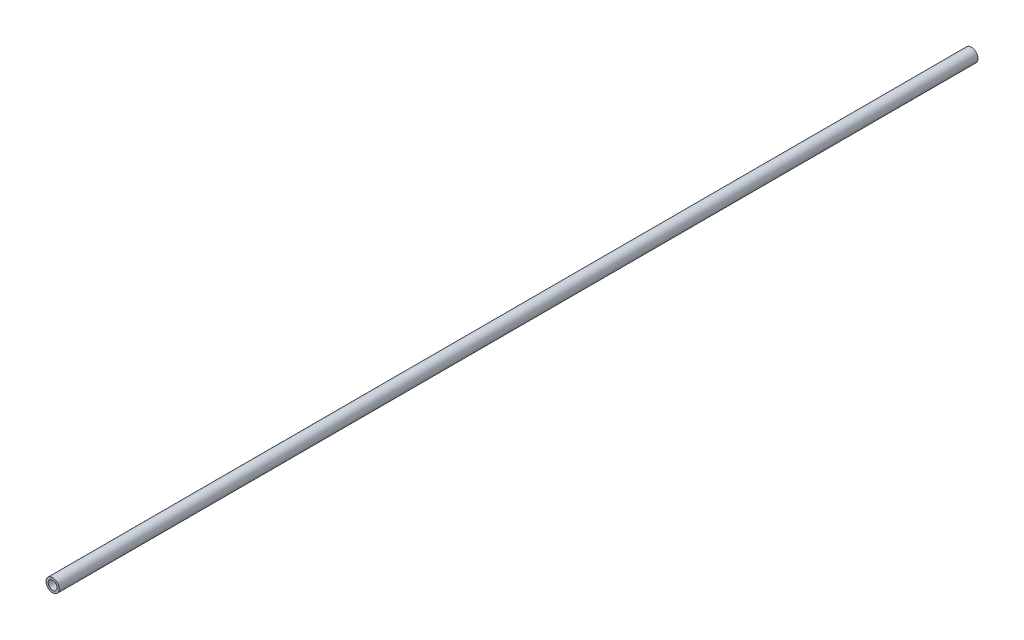
ISO-10303-21;
HEADER;
FILE_DESCRIPTION(('STEP AP214'),'2;1');
FILE_NAME('part.step','',(''),(''),'','','');
FILE_SCHEMA(('AUTOMOTIVE_DESIGN { 1 0 10303 214 1 1 1 1 }'));
ENDSEC;
DATA;
#1=APPLICATION_CONTEXT('core data for automotive mechanical design processes');
#2=APPLICATION_PROTOCOL_DEFINITION('international standard','automotive_design',2000,#1);
#3=PRODUCT_CONTEXT('',#1,'mechanical');
#4=PRODUCT('Part','Part','',(#3));
#5=PRODUCT_RELATED_PRODUCT_CATEGORY('part','',(#4));
#6=PRODUCT_DEFINITION_FORMATION('','',#4);
#7=PRODUCT_DEFINITION_CONTEXT('part definition',#1,'design');
#8=PRODUCT_DEFINITION('design','',#6,#7);
#9=PRODUCT_DEFINITION_SHAPE('','',#8);
#10=(LENGTH_UNIT() NAMED_UNIT(*) SI_UNIT(.MILLI.,.METRE.));
#11=(NAMED_UNIT(*) PLANE_ANGLE_UNIT() SI_UNIT($,.RADIAN.));
#12=(NAMED_UNIT(*) SI_UNIT($,.STERADIAN.) SOLID_ANGLE_UNIT());
#13=UNCERTAINTY_MEASURE_WITH_UNIT(LENGTH_MEASURE(1.E-05),#10,'distance_accuracy_value','');
#14=(GEOMETRIC_REPRESENTATION_CONTEXT(3) GLOBAL_UNCERTAINTY_ASSIGNED_CONTEXT((#13)) GLOBAL_UNIT_ASSIGNED_CONTEXT((#10,
#11,#12)) REPRESENTATION_CONTEXT('',''));
#15=CARTESIAN_POINT('',(0.,0.,0.));
#16=DIRECTION('',(0.,0.,1.));
#17=DIRECTION('',(1.,0.,0.));
#18=AXIS2_PLACEMENT_3D('',#15,#16,#17);
#19=CARTESIAN_POINT('',(0.,0.,417.5));
#20=DIRECTION('',(0.,0.,-1.));
#21=DIRECTION('',(-1.,0.,0.));
#22=AXIS2_PLACEMENT_3D('',#19,#20,#21);
#23=CYLINDRICAL_SURFACE('',#22,3.);
#24=CARTESIAN_POINT('',(0.,0.,417.5));
#25=DIRECTION('',(0.,0.,1.));
#26=DIRECTION('',(1.,0.,0.));
#27=AXIS2_PLACEMENT_3D('',#24,#25,#26);
#28=CIRCLE('',#27,3.);
#29=CARTESIAN_POINT('',(3.,0.,417.5));
#30=VERTEX_POINT('',#29);
#31=EDGE_CURVE('E10',#30,#30,#28,.T.);
#32=ORIENTED_EDGE('',*,*,#31,.F.);
#33=EDGE_LOOP('',(#32));
#34=FACE_BOUND('',#33,.T.);
#35=CARTESIAN_POINT('',(0.,0.,0.));
#36=DIRECTION('',(0.,0.,1.));
#37=DIRECTION('',(1.,0.,0.));
#38=AXIS2_PLACEMENT_3D('',#35,#36,#37);
#39=CIRCLE('',#38,3.);
#40=CARTESIAN_POINT('',(3.,0.,0.));
#41=VERTEX_POINT('',#40);
#42=EDGE_CURVE('E38',#41,#41,#39,.T.);
#43=ORIENTED_EDGE('',*,*,#42,.T.);
#44=EDGE_LOOP('',(#43));
#45=FACE_BOUND('',#44,.T.);
#46=ADVANCED_FACE('F35',(#34,#45),#23,.T.);
#47=CARTESIAN_POINT('',(0.,0.,417.5));
#48=DIRECTION('',(0.,0.,1.));
#49=DIRECTION('',(1.,0.,0.));
#50=AXIS2_PLACEMENT_3D('',#47,#48,#49);
#51=PLANE('',#50);
#52=CARTESIAN_POINT('',(0.,0.,417.5));
#53=DIRECTION('',(0.,0.,1.));
#54=DIRECTION('',(1.,0.,0.));
#55=AXIS2_PLACEMENT_3D('',#52,#53,#54);
#56=CIRCLE('',#55,2.);
#57=CARTESIAN_POINT('',(2.,0.,417.5));
#58=VERTEX_POINT('',#57);
#59=EDGE_CURVE('E45',#58,#58,#56,.T.);
#60=ORIENTED_EDGE('',*,*,#59,.F.);
#61=EDGE_LOOP('',(#60));
#62=FACE_BOUND('',#61,.T.);
#63=ORIENTED_EDGE('',*,*,#31,.T.);
#64=EDGE_LOOP('',(#63));
#65=FACE_BOUND('',#64,.T.);
#66=ADVANCED_FACE('F56',(#62,#65),#51,.T.);
#67=CARTESIAN_POINT('',(0.,0.,0.));
#68=DIRECTION('',(0.,0.,1.));
#69=DIRECTION('',(1.,0.,0.));
#70=AXIS2_PLACEMENT_3D('',#67,#68,#69);
#71=PLANE('',#70);
#72=CARTESIAN_POINT('',(0.,0.,0.));
#73=DIRECTION('',(0.,0.,1.));
#74=DIRECTION('',(1.,0.,0.));
#75=AXIS2_PLACEMENT_3D('',#72,#73,#74);
#76=CIRCLE('',#75,2.);
#77=CARTESIAN_POINT('',(2.,0.,0.));
#78=VERTEX_POINT('',#77);
#79=EDGE_CURVE('E47',#78,#78,#76,.T.);
#80=ORIENTED_EDGE('',*,*,#79,.T.);
#81=EDGE_LOOP('',(#80));
#82=FACE_BOUND('',#81,.T.);
#83=ORIENTED_EDGE('',*,*,#42,.F.);
#84=EDGE_LOOP('',(#83));
#85=FACE_BOUND('',#84,.T.);
#86=ADVANCED_FACE('F58',(#82,#85),#71,.F.);
#87=CARTESIAN_POINT('',(0.,0.,417.5));
#88=DIRECTION('',(0.,0.,-1.));
#89=DIRECTION('',(-1.,0.,0.));
#90=AXIS2_PLACEMENT_3D('',#87,#88,#89);
#91=CYLINDRICAL_SURFACE('',#90,2.);
#92=ORIENTED_EDGE('',*,*,#59,.T.);
#93=EDGE_LOOP('',(#92));
#94=FACE_BOUND('',#93,.T.);
#95=ORIENTED_EDGE('',*,*,#79,.F.);
#96=EDGE_LOOP('',(#95));
#97=FACE_BOUND('',#96,.T.);
#98=ADVANCED_FACE('F53',(#94,#97),#91,.F.);
#99=CLOSED_SHELL('',(#46,#66,#86,#98));
#100=MANIFOLD_SOLID_BREP('B2',#99);
#101=ADVANCED_BREP_SHAPE_REPRESENTATION('',(#18,#100),#14);
#102=SHAPE_DEFINITION_REPRESENTATION(#9,#101);
ENDSEC;
END-ISO-10303-21;
